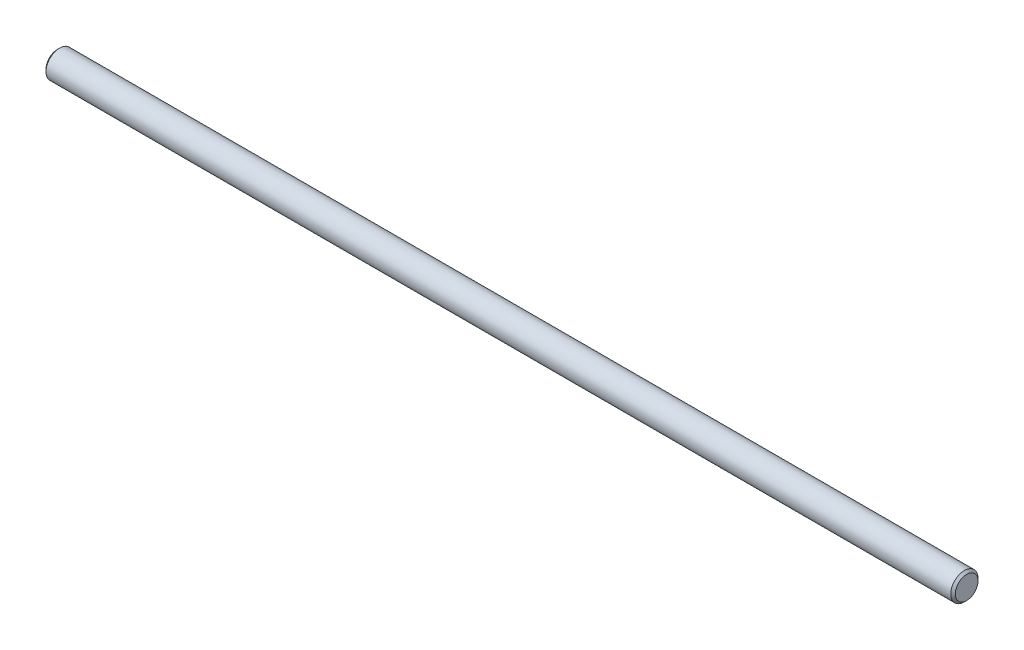
ISO-10303-21;
HEADER;
FILE_DESCRIPTION(('STEP AP214'),'2;1');
FILE_NAME('part.step','',(''),(''),'','','');
FILE_SCHEMA(('AUTOMOTIVE_DESIGN { 1 0 10303 214 1 1 1 1 }'));
ENDSEC;
DATA;
#1=APPLICATION_CONTEXT('core data for automotive mechanical design processes');
#2=APPLICATION_PROTOCOL_DEFINITION('international standard','automotive_design',2000,#1);
#3=PRODUCT_CONTEXT('',#1,'mechanical');
#4=PRODUCT('Part','Part','',(#3));
#5=PRODUCT_RELATED_PRODUCT_CATEGORY('part','',(#4));
#6=PRODUCT_DEFINITION_FORMATION('','',#4);
#7=PRODUCT_DEFINITION_CONTEXT('part definition',#1,'design');
#8=PRODUCT_DEFINITION('design','',#6,#7);
#9=PRODUCT_DEFINITION_SHAPE('','',#8);
#10=(LENGTH_UNIT() NAMED_UNIT(*) SI_UNIT(.MILLI.,.METRE.));
#11=(NAMED_UNIT(*) PLANE_ANGLE_UNIT() SI_UNIT($,.RADIAN.));
#12=(NAMED_UNIT(*) SI_UNIT($,.STERADIAN.) SOLID_ANGLE_UNIT());
#13=UNCERTAINTY_MEASURE_WITH_UNIT(LENGTH_MEASURE(1.E-05),#10,'distance_accuracy_value','');
#14=(GEOMETRIC_REPRESENTATION_CONTEXT(3) GLOBAL_UNCERTAINTY_ASSIGNED_CONTEXT((#13)) GLOBAL_UNIT_ASSIGNED_CONTEXT((#10,
#11,#12)) REPRESENTATION_CONTEXT('',''));
#15=CARTESIAN_POINT('',(0.,0.,0.));
#16=DIRECTION('',(0.,0.,1.));
#17=DIRECTION('',(1.,0.,0.));
#18=AXIS2_PLACEMENT_3D('',#15,#16,#17);
#19=CARTESIAN_POINT('',(0.,3.,0.));
#20=DIRECTION('',(1.,0.,0.));
#21=DIRECTION('',(0.,0.,-1.));
#22=AXIS2_PLACEMENT_3D('',#19,#20,#21);
#23=PLANE('',#22);
#24=CARTESIAN_POINT('',(0.,0.,0.));
#25=DIRECTION('',(1.,0.,0.));
#26=DIRECTION('',(0.,0.,-1.));
#27=AXIS2_PLACEMENT_3D('',#24,#25,#26);
#28=CIRCLE('',#27,2.50000000000006);
#29=CARTESIAN_POINT('',(0.,0.,-2.50000000000006));
#30=VERTEX_POINT('',#29);
#31=EDGE_CURVE('E48',#30,#30,#28,.F.);
#32=ORIENTED_EDGE('',*,*,#31,.T.);
#33=EDGE_LOOP('',(#32));
#34=FACE_BOUND('',#33,.T.);
#35=ADVANCED_FACE('F33',(#34),#23,.F.);
#36=CARTESIAN_POINT('',(200.,0.,0.));
#37=DIRECTION('',(-1.,0.,0.));
#38=DIRECTION('',(0.,0.,1.));
#39=AXIS2_PLACEMENT_3D('',#36,#37,#38);
#40=PLANE('',#39);
#41=CARTESIAN_POINT('',(200.,0.,0.));
#42=DIRECTION('',(-1.,0.,0.));
#43=DIRECTION('',(0.,0.,1.));
#44=AXIS2_PLACEMENT_3D('',#41,#42,#43);
#45=CIRCLE('',#44,2.50000000000009);
#46=CARTESIAN_POINT('',(200.,0.,2.50000000000009));
#47=VERTEX_POINT('',#46);
#48=EDGE_CURVE('E10',#47,#47,#45,.F.);
#49=ORIENTED_EDGE('',*,*,#48,.T.);
#50=EDGE_LOOP('',(#49));
#51=FACE_BOUND('',#50,.T.);
#52=ADVANCED_FACE('F64',(#51),#40,.F.);
#53=CARTESIAN_POINT('',(0.,0.,0.));
#54=DIRECTION('',(-1.,0.,0.));
#55=DIRECTION('',(0.,0.,1.));
#56=AXIS2_PLACEMENT_3D('',#53,#54,#55);
#57=CYLINDRICAL_SURFACE('',#56,3.00000000000001);
#58=CARTESIAN_POINT('',(0.499999999999963,0.,0.));
#59=DIRECTION('',(1.,0.,0.));
#60=DIRECTION('',(0.,0.,-1.));
#61=AXIS2_PLACEMENT_3D('',#58,#59,#60);
#62=CIRCLE('',#61,3.00000000000001);
#63=CARTESIAN_POINT('',(0.499999999999963,0.,-3.00000000000001));
#64=VERTEX_POINT('',#63);
#65=EDGE_CURVE('E40',#64,#64,#62,.T.);
#66=ORIENTED_EDGE('',*,*,#65,.T.);
#67=EDGE_LOOP('',(#66));
#68=FACE_BOUND('',#67,.T.);
#69=CARTESIAN_POINT('',(199.5,0.,0.));
#70=DIRECTION('',(-1.,0.,0.));
#71=DIRECTION('',(0.,0.,1.));
#72=AXIS2_PLACEMENT_3D('',#69,#70,#71);
#73=CIRCLE('',#72,3.00000000000001);
#74=CARTESIAN_POINT('',(199.5,0.,3.00000000000001));
#75=VERTEX_POINT('',#74);
#76=EDGE_CURVE('E44',#75,#75,#73,.T.);
#77=ORIENTED_EDGE('',*,*,#76,.T.);
#78=EDGE_LOOP('',(#77));
#79=FACE_BOUND('',#78,.T.);
#80=ADVANCED_FACE('F57',(#68,#79),#57,.T.);
#81=CARTESIAN_POINT('',(0.,0.,0.));
#82=DIRECTION('',(1.,0.,0.));
#83=DIRECTION('',(0.,0.,-1.));
#84=AXIS2_PLACEMENT_3D('',#81,#82,#83);
#85=CONICAL_SURFACE('',#84,2.50000000000006,0.785398163397438);
#86=ORIENTED_EDGE('',*,*,#65,.F.);
#87=EDGE_LOOP('',(#86));
#88=FACE_BOUND('',#87,.T.);
#89=ORIENTED_EDGE('',*,*,#31,.F.);
#90=EDGE_LOOP('',(#89));
#91=FACE_BOUND('',#90,.T.);
#92=ADVANCED_FACE('F55',(#88,#91),#85,.T.);
#93=CARTESIAN_POINT('',(199.5,0.,0.));
#94=DIRECTION('',(-1.,0.,0.));
#95=DIRECTION('',(0.,0.,1.));
#96=AXIS2_PLACEMENT_3D('',#93,#94,#95);
#97=CONICAL_SURFACE('',#96,3.00000000000001,0.7853981633974);
#98=ORIENTED_EDGE('',*,*,#48,.F.);
#99=EDGE_LOOP('',(#98));
#100=FACE_BOUND('',#99,.T.);
#101=ORIENTED_EDGE('',*,*,#76,.F.);
#102=EDGE_LOOP('',(#101));
#103=FACE_BOUND('',#102,.T.);
#104=ADVANCED_FACE('F35',(#100,#103),#97,.T.);
#105=CLOSED_SHELL('',(#35,#52,#80,#92,#104));
#106=MANIFOLD_SOLID_BREP('B2',#105);
#107=ADVANCED_BREP_SHAPE_REPRESENTATION('',(#18,#106),#14);
#108=SHAPE_DEFINITION_REPRESENTATION(#9,#107);
ENDSEC;
END-ISO-10303-21;
